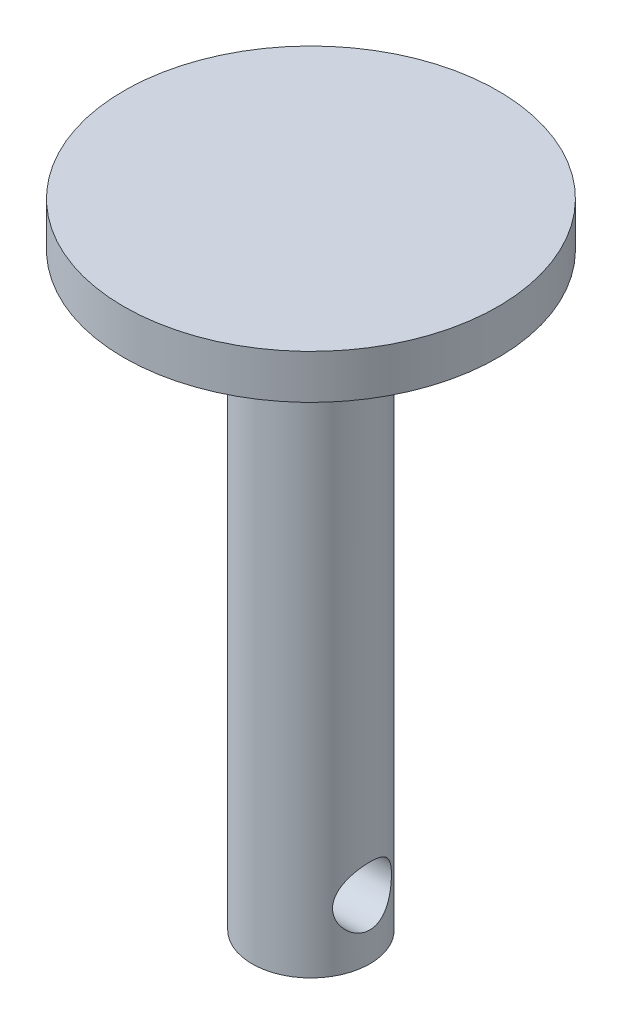
ISO-10303-21;
HEADER;
FILE_DESCRIPTION(('STEP AP214'),'2;1');
FILE_NAME('part.step','',(''),(''),'','','');
FILE_SCHEMA(('AUTOMOTIVE_DESIGN { 1 0 10303 214 1 1 1 1 }'));
ENDSEC;
DATA;
#1=APPLICATION_CONTEXT('core data for automotive mechanical design processes');
#2=APPLICATION_PROTOCOL_DEFINITION('international standard','automotive_design',2000,#1);
#3=PRODUCT_CONTEXT('',#1,'mechanical');
#4=PRODUCT('Part','Part','',(#3));
#5=PRODUCT_RELATED_PRODUCT_CATEGORY('part','',(#4));
#6=PRODUCT_DEFINITION_FORMATION('','',#4);
#7=PRODUCT_DEFINITION_CONTEXT('part definition',#1,'design');
#8=PRODUCT_DEFINITION('design','',#6,#7);
#9=PRODUCT_DEFINITION_SHAPE('','',#8);
#10=(LENGTH_UNIT() NAMED_UNIT(*) SI_UNIT(.MILLI.,.METRE.));
#11=(NAMED_UNIT(*) PLANE_ANGLE_UNIT() SI_UNIT($,.RADIAN.));
#12=(NAMED_UNIT(*) SI_UNIT($,.STERADIAN.) SOLID_ANGLE_UNIT());
#13=UNCERTAINTY_MEASURE_WITH_UNIT(LENGTH_MEASURE(1.E-05),#10,'distance_accuracy_value','');
#14=(GEOMETRIC_REPRESENTATION_CONTEXT(3) GLOBAL_UNCERTAINTY_ASSIGNED_CONTEXT((#13)) GLOBAL_UNIT_ASSIGNED_CONTEXT((#10,
#11,#12)) REPRESENTATION_CONTEXT('',''));
#15=CARTESIAN_POINT('',(0.,0.,0.));
#16=DIRECTION('',(0.,0.,1.));
#17=DIRECTION('',(1.,0.,0.));
#18=AXIS2_PLACEMENT_3D('',#15,#16,#17);
#19=CARTESIAN_POINT('',(0.,3.,0.));
#20=DIRECTION('',(0.,-1.,0.));
#21=DIRECTION('',(0.,0.,-1.));
#22=AXIS2_PLACEMENT_3D('',#19,#20,#21);
#23=CYLINDRICAL_SURFACE('',#22,12.7);
#24=CARTESIAN_POINT('',(0.,3.,0.));
#25=DIRECTION('',(0.,1.,0.));
#26=DIRECTION('',(0.,0.,1.));
#27=AXIS2_PLACEMENT_3D('',#24,#25,#26);
#28=CIRCLE('',#27,12.7);
#29=CARTESIAN_POINT('',(0.,3.,12.7));
#30=VERTEX_POINT('',#29);
#31=EDGE_CURVE('E51',#30,#30,#28,.T.);
#32=ORIENTED_EDGE('',*,*,#31,.F.);
#33=EDGE_LOOP('',(#32));
#34=FACE_BOUND('',#33,.T.);
#35=CARTESIAN_POINT('',(0.,0.,0.));
#36=DIRECTION('',(0.,1.,0.));
#37=DIRECTION('',(0.,0.,1.));
#38=AXIS2_PLACEMENT_3D('',#35,#36,#37);
#39=CIRCLE('',#38,12.7);
#40=CARTESIAN_POINT('',(0.,0.,12.7));
#41=VERTEX_POINT('',#40);
#42=EDGE_CURVE('E57',#41,#41,#39,.T.);
#43=ORIENTED_EDGE('',*,*,#42,.T.);
#44=EDGE_LOOP('',(#43));
#45=FACE_BOUND('',#44,.T.);
#46=ADVANCED_FACE('F35',(#34,#45),#23,.T.);
#47=CARTESIAN_POINT('',(0.,3.,0.));
#48=DIRECTION('',(0.,1.,0.));
#49=DIRECTION('',(0.,0.,1.));
#50=AXIS2_PLACEMENT_3D('',#47,#48,#49);
#51=PLANE('',#50);
#52=ORIENTED_EDGE('',*,*,#31,.T.);
#53=EDGE_LOOP('',(#52));
#54=FACE_BOUND('',#53,.T.);
#55=ADVANCED_FACE('F78',(#54),#51,.T.);
#56=CARTESIAN_POINT('',(0.,0.,0.));
#57=DIRECTION('',(0.,1.,0.));
#58=DIRECTION('',(0.,0.,1.));
#59=AXIS2_PLACEMENT_3D('',#56,#57,#58);
#60=PLANE('',#59);
#61=CARTESIAN_POINT('',(0.,0.,0.));
#62=DIRECTION('',(0.,-1.,0.));
#63=DIRECTION('',(0.,0.,-1.));
#64=AXIS2_PLACEMENT_3D('',#61,#62,#63);
#65=CIRCLE('',#64,4.);
#66=CARTESIAN_POINT('',(0.,0.,-4.));
#67=VERTEX_POINT('',#66);
#68=EDGE_CURVE('E47',#67,#67,#65,.T.);
#69=ORIENTED_EDGE('',*,*,#68,.F.);
#70=EDGE_LOOP('',(#69));
#71=FACE_BOUND('',#70,.T.);
#72=ORIENTED_EDGE('',*,*,#42,.F.);
#73=EDGE_LOOP('',(#72));
#74=FACE_BOUND('',#73,.T.);
#75=ADVANCED_FACE('F74',(#71,#74),#60,.F.);
#76=CARTESIAN_POINT('',(0.,-40.,0.));
#77=DIRECTION('',(0.,1.,0.));
#78=DIRECTION('',(0.,0.,1.));
#79=AXIS2_PLACEMENT_3D('',#76,#77,#78);
#80=CYLINDRICAL_SURFACE('',#79,4.);
#81=CARTESIAN_POINT('',(-3.46410161513775,-36.,-2.));
#82=CARTESIAN_POINT('',(-3.46411185715888,-35.8957867945257,-1.99999158748781));
#83=CARTESIAN_POINT('',(-3.46887633544978,-35.7914378234662,-1.99179963610437));
#84=CARTESIAN_POINT('',(-3.48724701669072,-35.5859448227694,-1.95944672580053));
#85=CARTESIAN_POINT('',(-3.50087179788183,-35.4848079967522,-1.93525221095662));
#86=CARTESIAN_POINT('',(-3.53498701490001,-35.2890968435531,-1.8721998159803));
#87=CARTESIAN_POINT('',(-3.55544089069169,-35.1944907411508,-1.83341988295964));
#88=CARTESIAN_POINT('',(-3.60085327291132,-35.0131515495239,-1.74253507245139));
#89=CARTESIAN_POINT('',(-3.62581202301253,-34.9264188865632,-1.69042947410139));
#90=CARTESIAN_POINT('',(-3.67993738819289,-34.7553885568666,-1.569333074538));
#91=CARTESIAN_POINT('',(-3.70928127465103,-34.6718817324082,-1.49930407053533));
#92=CARTESIAN_POINT('',(-3.76743965382121,-34.5171832194294,-1.34650761698202));
#93=CARTESIAN_POINT('',(-3.79625387610258,-34.445997673796,-1.26373385204842));
#94=CARTESIAN_POINT('',(-3.85242953961661,-34.3132656988115,-1.08097912631265));
#95=CARTESIAN_POINT('',(-3.87956212851245,-34.2526924645767,-0.980214377887153));
#96=CARTESIAN_POINT('',(-3.92701512184167,-34.1497182932129,-0.768314053336917));
#97=CARTESIAN_POINT('',(-3.94733982363631,-34.1073058876492,-0.657185076311987));
#98=CARTESIAN_POINT('',(-3.97760922492053,-34.0449906774688,-0.43608988781882));
#99=CARTESIAN_POINT('',(-3.98818960442739,-34.0237009473079,-0.326603580968787));
#100=CARTESIAN_POINT('',(-4.00015167691179,-33.999667762631,-0.105141257404541));
#101=CARTESIAN_POINT('',(-4.00153893568935,-33.9969130864037,0.00683321168520689));
#102=CARTESIAN_POINT('',(-3.99525963833124,-34.0094933479451,0.219665048849572));
#103=CARTESIAN_POINT('',(-3.98836991784381,-34.0232760310436,0.320642398354139));
#104=CARTESIAN_POINT('',(-3.96748490519435,-34.0657616878081,0.518627543836089));
#105=CARTESIAN_POINT('',(-3.95348908132771,-34.0944657779521,0.615635042187702));
#106=CARTESIAN_POINT('',(-3.91943166575325,-34.16616513218,0.80461878313926));
#107=CARTESIAN_POINT('',(-3.89928883058403,-34.2093526263442,0.896506847030397));
#108=CARTESIAN_POINT('',(-3.8547529197337,-34.3085268324029,1.07195360302662));
#109=CARTESIAN_POINT('',(-3.83035832314967,-34.3645181266047,1.15550929767728));
#110=CARTESIAN_POINT('',(-3.7768878879846,-34.4937907030661,1.3203473217964));
#111=CARTESIAN_POINT('',(-3.7475875199635,-34.568206056652,1.40066815005873));
#112=CARTESIAN_POINT('',(-3.68908681173623,-34.7291794498603,1.54820874059556));
#113=CARTESIAN_POINT('',(-3.65988656531257,-34.8157467445481,1.61541842314846));
#114=CARTESIAN_POINT('',(-3.60288312184969,-35.0052963848482,1.73901066928443));
#115=CARTESIAN_POINT('',(-3.57528639981415,-35.1089720461084,1.7944346299561));
#116=CARTESIAN_POINT('',(-3.52750900557152,-35.325875342718,1.88663822600246));
#117=CARTESIAN_POINT('',(-3.50732060092135,-35.4390928660351,1.92343731642178));
#118=CARTESIAN_POINT('',(-3.47889271634069,-35.6624290225656,1.97436042205008));
#119=CARTESIAN_POINT('',(-3.46983311696993,-35.7720822380871,1.99005024423995));
#120=CARTESIAN_POINT('',(-3.46235838723219,-35.9928026830331,2.00303389322286));
#121=CARTESIAN_POINT('',(-3.46393573778623,-36.1038688582396,2.00034071463006));
#122=CARTESIAN_POINT('',(-3.4766867308117,-36.3113078371575,1.97807208668793));
#123=CARTESIAN_POINT('',(-3.48679175013308,-36.4079589022158,1.96037563342492));
#124=CARTESIAN_POINT('',(-3.51388043102682,-36.596735572542,1.91139256926489));
#125=CARTESIAN_POINT('',(-3.53086632010068,-36.6888597014935,1.88010155724727));
#126=CARTESIAN_POINT('',(-3.57072444159313,-36.8708226618051,1.80329517720974));
#127=CARTESIAN_POINT('',(-3.59383286486126,-36.9603580337061,1.7571881273853));
#128=CARTESIAN_POINT('',(-3.643122389945,-37.130938543079,1.65257412803176));
#129=CARTESIAN_POINT('',(-3.66930506710298,-37.2119792870305,1.59406080866499));
#130=CARTESIAN_POINT('',(-3.72575996912669,-37.3739575350427,1.45767433439709));
#131=CARTESIAN_POINT('',(-3.75613166308566,-37.4535943014178,1.37829054462748));
#132=CARTESIAN_POINT('',(-3.81468469955797,-37.5988244760047,1.20680899079904));
#133=CARTESIAN_POINT('',(-3.84286530015463,-37.6644131405268,1.11470694931991));
#134=CARTESIAN_POINT('',(-3.89482723381867,-37.7811474518327,0.917070725108062));
#135=CARTESIAN_POINT('',(-3.91847283343884,-37.8318662361668,0.811246195112497));
#136=CARTESIAN_POINT('',(-3.95766709918776,-37.9142758079696,0.591044729317867));
#137=CARTESIAN_POINT('',(-3.97322287353397,-37.9459833036841,0.476675402917655));
#138=CARTESIAN_POINT('',(-3.99335016363174,-37.9867371274851,0.253959364539766));
#139=CARTESIAN_POINT('',(-3.9987985581427,-37.9975957486643,0.146022887268302));
#140=CARTESIAN_POINT('',(-4.00084260752374,-38.0016865339957,-0.0702519714699437));
#141=CARTESIAN_POINT('',(-3.99744136141634,-37.9949248685289,-0.178590198981612));
#142=CARTESIAN_POINT('',(-3.98267937668509,-37.9651671756836,-0.385075986136858));
#143=CARTESIAN_POINT('',(-3.97185789309443,-37.943270262691,-0.483424641057419));
#144=CARTESIAN_POINT('',(-3.94384187353387,-37.8853460401933,-0.674891898931566));
#145=CARTESIAN_POINT('',(-3.92664642364424,-37.8493167042931,-0.768009749669772));
#146=CARTESIAN_POINT('',(-3.8865186139318,-37.7625457450086,-0.950846833596741));
#147=CARTESIAN_POINT('',(-3.86337234005404,-37.7112407802481,-1.0402503657229));
#148=CARTESIAN_POINT('',(-3.81376266676027,-37.5960847118819,-1.20954920326828));
#149=CARTESIAN_POINT('',(-3.78729774583427,-37.5322278458984,-1.28944011444319));
#150=CARTESIAN_POINT('',(-3.73057218840582,-37.3864033644406,-1.44582833859495));
#151=CARTESIAN_POINT('',(-3.70019591726075,-37.3032658191997,-1.52119665879199));
#152=CARTESIAN_POINT('',(-3.64126158628571,-37.1251077716939,-1.65732528394006));
#153=CARTESIAN_POINT('',(-3.61270515130784,-37.0300768686395,-1.71807266521244));
#154=CARTESIAN_POINT('',(-3.55999186256751,-36.8266911058698,-1.82486714716811));
#155=CARTESIAN_POINT('',(-3.53600256268535,-36.7180100892647,-1.87038902381914));
#156=CARTESIAN_POINT('',(-3.5069621813237,-36.5494218803691,-1.92395929504801));
#157=CARTESIAN_POINT('',(-3.49844389329401,-36.4923521794093,-1.93935666147967));
#158=CARTESIAN_POINT('',(-3.48406059323535,-36.3767674424998,-1.96508069805043));
#159=CARTESIAN_POINT('',(-3.47819372636051,-36.3182534472458,-1.97541091343283));
#160=CARTESIAN_POINT('',(-3.47059023668758,-36.2163992107527,-1.9887293296122));
#161=CARTESIAN_POINT('',(-3.46816389731815,-36.1732669427499,-1.99295091983786));
#162=CARTESIAN_POINT('',(-3.46491740045177,-36.0867643069071,-1.99858810035606));
#163=CARTESIAN_POINT('',(-3.46409735040492,-36.0433939233333,-2.00000350293331));
#164=CARTESIAN_POINT('',(-3.46410161513775,-36.,-2.));
#165=B_SPLINE_CURVE_WITH_KNOTS('',3,(#81,#82,#83,#84,#85,#86,#87,#88,#89,#90,#91,#92,#93,#94,
#95,#96,#97,#98,#99,#100,#101,#102,#103,#104,#105,#106,#107,#108,#109,#110,#111,#112,#113,#114,
#115,#116,#117,#118,#119,#120,#121,#122,#123,#124,#125,#126,#127,#128,#129,#130,#131,#132,#133,
#134,#135,#136,#137,#138,#139,#140,#141,#142,#143,#144,#145,#146,#147,#148,#149,#150,#151,#152,
#153,#154,#155,#156,#157,#158,#159,#160,#161,#162,#163,#164),.UNSPECIFIED.,.T.,.F.,(4,2,2,2,2,2,
2,2,2,2,2,2,2,2,2,2,2,2,2,2,2,2,2,2,2,2,2,2,2,2,2,2,2,2,2,2,2,2,2,2,2,4),(0.,0.312464245189426,
0.62558578564961,0.937057191861532,1.24854545093096,1.58572462503713,1.92307142172808,
2.28315784481594,2.64301653931849,2.97726969939937,3.31132047376147,3.61632194973144,
3.92134625038977,4.2305906946636,4.53994598704611,4.87854382917849,5.21740096495904,
5.57777683462964,5.93777548427477,6.26924581712491,6.60048186380814,6.89548366852119,
7.19058104876193,7.49934592816243,7.80826972444162,8.15613487165294,8.50411729960472,
8.86128362829999,9.21813559621611,9.54224540783041,9.86624173592011,10.1688884974705,
10.4715786702809,10.7872150144301,11.1029966020551,11.450204837042,11.7977188569438,
12.1562149808128,12.3351395323571,12.5139387197526,12.6440387634036,12.7741475095882),.UNSPECIFIED.);
#166=CARTESIAN_POINT('',(-3.46410161513775,-36.,-2.));
#167=VERTEX_POINT('',#166);
#168=EDGE_CURVE('E38',#167,#167,#165,.T.);
#169=ORIENTED_EDGE('',*,*,#168,.T.);
#170=EDGE_LOOP('',(#169));
#171=FACE_BOUND('',#170,.T.);
#172=CARTESIAN_POINT('',(3.46410161513775,-36.,-2.));
#173=CARTESIAN_POINT('',(3.46411185715888,-36.1042132054744,-1.99999158748781));
#174=CARTESIAN_POINT('',(3.46887633544978,-36.2085621765338,-1.99179963610437));
#175=CARTESIAN_POINT('',(3.48724701669072,-36.4140551772306,-1.95944672580053));
#176=CARTESIAN_POINT('',(3.50087179788183,-36.5151920032478,-1.93525221095662));
#177=CARTESIAN_POINT('',(3.53498701490001,-36.7109031564469,-1.8721998159803));
#178=CARTESIAN_POINT('',(3.55544089069169,-36.8055092588493,-1.83341988295964));
#179=CARTESIAN_POINT('',(3.60085327291132,-36.9868484504762,-1.74253507245139));
#180=CARTESIAN_POINT('',(3.62581202301253,-37.0735811134368,-1.69042947410139));
#181=CARTESIAN_POINT('',(3.67993738819289,-37.2446114431334,-1.569333074538));
#182=CARTESIAN_POINT('',(3.70928127465103,-37.3281182675918,-1.49930407053533));
#183=CARTESIAN_POINT('',(3.76743965382121,-37.4828167805706,-1.34650761698202));
#184=CARTESIAN_POINT('',(3.79625387610258,-37.554002326204,-1.26373385204841));
#185=CARTESIAN_POINT('',(3.85242953961661,-37.6867343011885,-1.08097912631265));
#186=CARTESIAN_POINT('',(3.87956212851245,-37.7473075354233,-0.980214377887158));
#187=CARTESIAN_POINT('',(3.92701512184167,-37.8502817067871,-0.768314053336923));
#188=CARTESIAN_POINT('',(3.94733982363631,-37.8926941123508,-0.65718507631199));
#189=CARTESIAN_POINT('',(3.97760922492053,-37.9550093225312,-0.43608988781882));
#190=CARTESIAN_POINT('',(3.9881896044274,-37.9762990526921,-0.326603580968787));
#191=CARTESIAN_POINT('',(4.00015167691179,-38.000332237369,-0.105141257404541));
#192=CARTESIAN_POINT('',(4.00153893568935,-38.0030869135963,0.00683321168520686));
#193=CARTESIAN_POINT('',(3.99525963833124,-37.9905066520549,0.219665048849572));
#194=CARTESIAN_POINT('',(3.98836991784381,-37.9767239689564,0.320642398354139));
#195=CARTESIAN_POINT('',(3.96748490519435,-37.9342383121919,0.518627543836089));
#196=CARTESIAN_POINT('',(3.95348908132771,-37.9055342220479,0.615635042187702));
#197=CARTESIAN_POINT('',(3.91943166575325,-37.8338348678201,0.80461878313926));
#198=CARTESIAN_POINT('',(3.89928883058403,-37.7906473736558,0.896506847030397));
#199=CARTESIAN_POINT('',(3.8547529197337,-37.6914731675971,1.07195360302662));
#200=CARTESIAN_POINT('',(3.83035832314967,-37.6354818733953,1.15550929767728));
#201=CARTESIAN_POINT('',(3.7768878879846,-37.5062092969339,1.3203473217964));
#202=CARTESIAN_POINT('',(3.7475875199635,-37.431793943348,1.40066815005873));
#203=CARTESIAN_POINT('',(3.68908681173623,-37.2708205501397,1.54820874059556));
#204=CARTESIAN_POINT('',(3.65988656531257,-37.1842532554519,1.61541842314846));
#205=CARTESIAN_POINT('',(3.60288312184969,-36.9947036151518,1.73901066928443));
#206=CARTESIAN_POINT('',(3.57528639981415,-36.8910279538916,1.7944346299561));
#207=CARTESIAN_POINT('',(3.52750900557152,-36.674124657282,1.88663822600246));
#208=CARTESIAN_POINT('',(3.50732060092135,-36.5609071339649,1.92343731642178));
#209=CARTESIAN_POINT('',(3.47889271634069,-36.3375709774344,1.97436042205008));
#210=CARTESIAN_POINT('',(3.46983311696993,-36.2279177619129,1.99005024423995));
#211=CARTESIAN_POINT('',(3.46235838723219,-36.0071973169669,2.00303389322286));
#212=CARTESIAN_POINT('',(3.46393573778623,-35.8961311417604,2.00034071463006));
#213=CARTESIAN_POINT('',(3.4766867308117,-35.6886921628426,1.97807208668793));
#214=CARTESIAN_POINT('',(3.48679175013308,-35.5920410977842,1.96037563342492));
#215=CARTESIAN_POINT('',(3.51388043102682,-35.403264427458,1.91139256926489));
#216=CARTESIAN_POINT('',(3.53086632010068,-35.3111402985065,1.88010155724727));
#217=CARTESIAN_POINT('',(3.57072444159313,-35.1291773381949,1.80329517720974));
#218=CARTESIAN_POINT('',(3.59383286486126,-35.039641966294,1.7571881273853));
#219=CARTESIAN_POINT('',(3.643122389945,-34.869061456921,1.65257412803176));
#220=CARTESIAN_POINT('',(3.66930506710298,-34.7880207129695,1.59406080866499));
#221=CARTESIAN_POINT('',(3.72575996912669,-34.6260424649573,1.45767433439709));
#222=CARTESIAN_POINT('',(3.75613166308566,-34.5464056985822,1.37829054462748));
#223=CARTESIAN_POINT('',(3.81468469955797,-34.4011755239953,1.20680899079904));
#224=CARTESIAN_POINT('',(3.84286530015463,-34.3355868594732,1.11470694931991));
#225=CARTESIAN_POINT('',(3.89482723381867,-34.2188525481673,0.917070725108062));
#226=CARTESIAN_POINT('',(3.91847283343884,-34.1681337638332,0.811246195112497));
#227=CARTESIAN_POINT('',(3.95766709918776,-34.0857241920304,0.591044729317867));
#228=CARTESIAN_POINT('',(3.97322287353397,-34.0540166963159,0.476675402917655));
#229=CARTESIAN_POINT('',(3.99335016363174,-34.0132628725149,0.253959364539766));
#230=CARTESIAN_POINT('',(3.9987985581427,-34.0024042513357,0.146022887268302));
#231=CARTESIAN_POINT('',(4.00084260752374,-33.9983134660043,-0.0702519714699437));
#232=CARTESIAN_POINT('',(3.99744136141634,-34.0050751314711,-0.178590198981612));
#233=CARTESIAN_POINT('',(3.98267937668509,-34.0348328243164,-0.385075986136858));
#234=CARTESIAN_POINT('',(3.97185789309443,-34.0567297373091,-0.483424641057419));
#235=CARTESIAN_POINT('',(3.94384187353387,-34.1146539598067,-0.674891898931566));
#236=CARTESIAN_POINT('',(3.92664642364424,-34.1506832957069,-0.768009749669772));
#237=CARTESIAN_POINT('',(3.8865186139318,-34.2374542549914,-0.950846833596741));
#238=CARTESIAN_POINT('',(3.86337234005404,-34.2887592197519,-1.0402503657229));
#239=CARTESIAN_POINT('',(3.81376266676027,-34.4039152881181,-1.20954920326828));
#240=CARTESIAN_POINT('',(3.78729774583427,-34.4677721541016,-1.28944011444319));
#241=CARTESIAN_POINT('',(3.73057218840582,-34.6135966355594,-1.44582833859495));
#242=CARTESIAN_POINT('',(3.70019591726075,-34.6967341808003,-1.52119665879199));
#243=CARTESIAN_POINT('',(3.64126158628571,-34.8748922283061,-1.65732528394006));
#244=CARTESIAN_POINT('',(3.61270515130784,-34.9699231313605,-1.71807266521244));
#245=CARTESIAN_POINT('',(3.55999186256751,-35.1733088941302,-1.82486714716811));
#246=CARTESIAN_POINT('',(3.53600256268535,-35.2819899107353,-1.87038902381914));
#247=CARTESIAN_POINT('',(3.5069621813237,-35.4505781196309,-1.92395929504801));
#248=CARTESIAN_POINT('',(3.49844389329401,-35.5076478205907,-1.93935666147967));
#249=CARTESIAN_POINT('',(3.48406059323535,-35.6232325575002,-1.96508069805043));
#250=CARTESIAN_POINT('',(3.47819372636051,-35.6817465527543,-1.97541091343283));
#251=CARTESIAN_POINT('',(3.47059023668758,-35.7836007892473,-1.9887293296122));
#252=CARTESIAN_POINT('',(3.46816389731815,-35.8267330572501,-1.99295091983786));
#253=CARTESIAN_POINT('',(3.46491740045177,-35.9132356930929,-1.99858810035606));
#254=CARTESIAN_POINT('',(3.46409735040492,-35.9566060766667,-2.00000350293331));
#255=CARTESIAN_POINT('',(3.46410161513775,-36.,-2.));
#256=B_SPLINE_CURVE_WITH_KNOTS('',3,(#172,#173,#174,#175,#176,#177,#178,#179,#180,#181,#182,
#183,#184,#185,#186,#187,#188,#189,#190,#191,#192,#193,#194,#195,#196,#197,#198,#199,#200,#201,
#202,#203,#204,#205,#206,#207,#208,#209,#210,#211,#212,#213,#214,#215,#216,#217,#218,#219,#220,
#221,#222,#223,#224,#225,#226,#227,#228,#229,#230,#231,#232,#233,#234,#235,#236,#237,#238,#239,
#240,#241,#242,#243,#244,#245,#246,#247,#248,#249,#250,#251,#252,#253,#254,#255),.UNSPECIFIED.,
.T.,.F.,(4,2,2,2,2,2,2,2,2,2,2,2,2,2,2,2,2,2,2,2,2,2,2,2,2,2,2,2,2,2,2,2,2,2,2,2,2,2,2,2,2,4),
(0.,0.312464245189426,0.62558578564961,0.937057191861532,1.24854545093096,1.58572462503713,
1.92307142172808,2.28315784481593,2.64301653931849,2.97726969939937,3.31132047376147,
3.61632194973144,3.92134625038977,4.23059069466361,4.53994598704611,4.87854382917849,
5.21740096495904,5.57777683462964,5.93777548427477,6.26924581712491,6.60048186380814,
6.89548366852119,7.19058104876193,7.49934592816243,7.80826972444162,8.15613487165294,
8.50411729960472,8.86128362829999,9.21813559621611,9.54224540783041,9.86624173592011,
10.1688884974705,10.4715786702809,10.7872150144301,11.1029966020551,11.450204837042,
11.7977188569438,12.1562149808128,12.3351395323571,12.5139387197526,12.6440387634036,
12.7741475095882),.UNSPECIFIED.);
#257=CARTESIAN_POINT('',(3.46410161513775,-36.,-2.));
#258=VERTEX_POINT('',#257);
#259=EDGE_CURVE('E10',#258,#258,#256,.T.);
#260=ORIENTED_EDGE('',*,*,#259,.T.);
#261=EDGE_LOOP('',(#260));
#262=FACE_BOUND('',#261,.T.);
#263=CARTESIAN_POINT('',(0.,-40.,0.));
#264=DIRECTION('',(0.,-1.,0.));
#265=DIRECTION('',(0.,0.,-1.));
#266=AXIS2_PLACEMENT_3D('',#263,#264,#265);
#267=CIRCLE('',#266,4.);
#268=CARTESIAN_POINT('',(0.,-40.,-4.));
#269=VERTEX_POINT('',#268);
#270=EDGE_CURVE('E90',#269,#269,#267,.T.);
#271=ORIENTED_EDGE('',*,*,#270,.F.);
#272=EDGE_LOOP('',(#271));
#273=FACE_BOUND('',#272,.T.);
#274=ORIENTED_EDGE('',*,*,#68,.T.);
#275=EDGE_LOOP('',(#274));
#276=FACE_BOUND('',#275,.T.);
#277=ADVANCED_FACE('F59',(#171,#262,#273,#276),#80,.T.);
#278=CARTESIAN_POINT('',(0.,-40.,0.));
#279=DIRECTION('',(0.,-1.,0.));
#280=DIRECTION('',(0.,0.,-1.));
#281=AXIS2_PLACEMENT_3D('',#278,#279,#280);
#282=PLANE('',#281);
#283=ORIENTED_EDGE('',*,*,#270,.T.);
#284=EDGE_LOOP('',(#283));
#285=FACE_BOUND('',#284,.T.);
#286=ADVANCED_FACE('F66',(#285),#282,.T.);
#287=CARTESIAN_POINT('',(-6.,-36.,0.));
#288=DIRECTION('',(1.,0.,0.));
#289=DIRECTION('',(0.,0.,-1.));
#290=AXIS2_PLACEMENT_3D('',#287,#288,#289);
#291=CYLINDRICAL_SURFACE('',#290,2.);
#292=ORIENTED_EDGE('',*,*,#259,.F.);
#293=EDGE_LOOP('',(#292));
#294=FACE_BOUND('',#293,.T.);
#295=ORIENTED_EDGE('',*,*,#168,.F.);
#296=EDGE_LOOP('',(#295));
#297=FACE_BOUND('',#296,.T.);
#298=ADVANCED_FACE('F63',(#294,#297),#291,.F.);
#299=CLOSED_SHELL('',(#46,#55,#75,#277,#286,#298));
#300=MANIFOLD_SOLID_BREP('B2',#299);
#301=ADVANCED_BREP_SHAPE_REPRESENTATION('',(#18,#300),#14);
#302=SHAPE_DEFINITION_REPRESENTATION(#9,#301);
ENDSEC;
END-ISO-10303-21;
